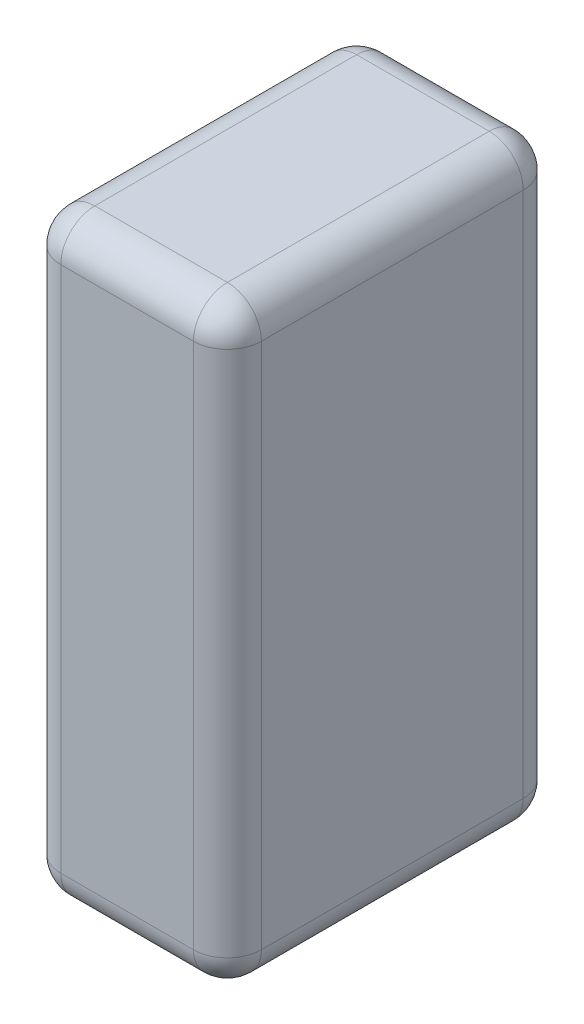
ISO-10303-21;
HEADER;
FILE_DESCRIPTION(('STEP AP214'),'2;1');
FILE_NAME('part.step','',(''),(''),'','','');
FILE_SCHEMA(('AUTOMOTIVE_DESIGN { 1 0 10303 214 1 1 1 1 }'));
ENDSEC;
DATA;
#1=APPLICATION_CONTEXT('core data for automotive mechanical design processes');
#2=APPLICATION_PROTOCOL_DEFINITION('international standard','automotive_design',2000,#1);
#3=PRODUCT_CONTEXT('',#1,'mechanical');
#4=PRODUCT('Part','Part','',(#3));
#5=PRODUCT_RELATED_PRODUCT_CATEGORY('part','',(#4));
#6=PRODUCT_DEFINITION_FORMATION('','',#4);
#7=PRODUCT_DEFINITION_CONTEXT('part definition',#1,'design');
#8=PRODUCT_DEFINITION('design','',#6,#7);
#9=PRODUCT_DEFINITION_SHAPE('','',#8);
#10=(LENGTH_UNIT() NAMED_UNIT(*) SI_UNIT(.MILLI.,.METRE.));
#11=(NAMED_UNIT(*) PLANE_ANGLE_UNIT() SI_UNIT($,.RADIAN.));
#12=(NAMED_UNIT(*) SI_UNIT($,.STERADIAN.) SOLID_ANGLE_UNIT());
#13=UNCERTAINTY_MEASURE_WITH_UNIT(LENGTH_MEASURE(1.E-05),#10,'distance_accuracy_value','');
#14=(GEOMETRIC_REPRESENTATION_CONTEXT(3) GLOBAL_UNCERTAINTY_ASSIGNED_CONTEXT((#13)) GLOBAL_UNIT_ASSIGNED_CONTEXT((#10,
#11,#12)) REPRESENTATION_CONTEXT('',''));
#15=CARTESIAN_POINT('',(0.,0.,0.));
#16=DIRECTION('',(0.,0.,1.));
#17=DIRECTION('',(1.,0.,0.));
#18=AXIS2_PLACEMENT_3D('',#15,#16,#17);
#19=CARTESIAN_POINT('',(2.95,17.5,-4.85));
#20=DIRECTION('',(-1.,0.,0.));
#21=DIRECTION('',(0.,0.,1.));
#22=AXIS2_PLACEMENT_3D('',#19,#20,#21);
#23=PLANE('',#22);
#24=DIRECTION('',(0.,0.,-1.));
#25=VECTOR('',#24,1.);
#26=CARTESIAN_POINT('',(2.95,1.,-4.85));
#27=LINE('',#26,#25);
#28=CARTESIAN_POINT('',(2.95,1.,3.85));
#29=VERTEX_POINT('',#28);
#30=CARTESIAN_POINT('',(2.95,1.,-3.85));
#31=VERTEX_POINT('',#30);
#32=EDGE_CURVE('E49',#29,#31,#27,.T.);
#33=ORIENTED_EDGE('',*,*,#32,.T.);
#34=DIRECTION('',(0.,-1.,0.));
#35=VECTOR('',#34,1.);
#36=CARTESIAN_POINT('',(2.95,17.5,-3.85));
#37=LINE('',#36,#35);
#38=CARTESIAN_POINT('',(2.95,16.5,-3.85));
#39=VERTEX_POINT('',#38);
#40=EDGE_CURVE('E11',#31,#39,#37,.F.);
#41=ORIENTED_EDGE('',*,*,#40,.T.);
#42=DIRECTION('',(0.,0.,-1.));
#43=VECTOR('',#42,1.);
#44=CARTESIAN_POINT('',(2.95,16.5,4.85));
#45=LINE('',#44,#43);
#46=CARTESIAN_POINT('',(2.95,16.5,3.85));
#47=VERTEX_POINT('',#46);
#48=EDGE_CURVE('E229',#39,#47,#45,.F.);
#49=ORIENTED_EDGE('',*,*,#48,.T.);
#50=DIRECTION('',(0.,-1.,0.));
#51=VECTOR('',#50,1.);
#52=CARTESIAN_POINT('',(2.95,17.5,3.85));
#53=LINE('',#52,#51);
#54=EDGE_CURVE('E226',#47,#29,#53,.T.);
#55=ORIENTED_EDGE('',*,*,#54,.T.);
#56=EDGE_LOOP('',(#33,#41,#49,#55));
#57=FACE_BOUND('',#56,.T.);
#58=ADVANCED_FACE('F39',(#57),#23,.F.);
#59=CARTESIAN_POINT('',(-2.95,17.5,-4.85));
#60=DIRECTION('',(0.,0.,1.));
#61=DIRECTION('',(1.,0.,0.));
#62=AXIS2_PLACEMENT_3D('',#59,#60,#61);
#63=PLANE('',#62);
#64=DIRECTION('',(-1.,0.,0.));
#65=VECTOR('',#64,1.);
#66=CARTESIAN_POINT('',(-2.95,1.,-4.85));
#67=LINE('',#66,#65);
#68=CARTESIAN_POINT('',(1.95,1.,-4.85));
#69=VERTEX_POINT('',#68);
#70=CARTESIAN_POINT('',(-1.95,1.,-4.85));
#71=VERTEX_POINT('',#70);
#72=EDGE_CURVE('E182',#69,#71,#67,.T.);
#73=ORIENTED_EDGE('',*,*,#72,.T.);
#74=DIRECTION('',(0.,-1.,0.));
#75=VECTOR('',#74,1.);
#76=CARTESIAN_POINT('',(-1.95,17.5,-4.85));
#77=LINE('',#76,#75);
#78=CARTESIAN_POINT('',(-1.95,16.5,-4.85));
#79=VERTEX_POINT('',#78);
#80=EDGE_CURVE('E139',#71,#79,#77,.F.);
#81=ORIENTED_EDGE('',*,*,#80,.T.);
#82=DIRECTION('',(-1.,0.,0.));
#83=VECTOR('',#82,1.);
#84=CARTESIAN_POINT('',(2.95,16.5,-4.85));
#85=LINE('',#84,#83);
#86=CARTESIAN_POINT('',(1.95,16.5,-4.85));
#87=VERTEX_POINT('',#86);
#88=EDGE_CURVE('E175',#79,#87,#85,.F.);
#89=ORIENTED_EDGE('',*,*,#88,.T.);
#90=DIRECTION('',(0.,-1.,0.));
#91=VECTOR('',#90,1.);
#92=CARTESIAN_POINT('',(1.95,17.5,-4.85));
#93=LINE('',#92,#91);
#94=EDGE_CURVE('E171',#87,#69,#93,.T.);
#95=ORIENTED_EDGE('',*,*,#94,.T.);
#96=EDGE_LOOP('',(#73,#81,#89,#95));
#97=FACE_BOUND('',#96,.T.);
#98=ADVANCED_FACE('F353',(#97),#63,.F.);
#99=CARTESIAN_POINT('',(-2.95,17.5,-4.85));
#100=DIRECTION('',(1.,0.,0.));
#101=DIRECTION('',(0.,0.,-1.));
#102=AXIS2_PLACEMENT_3D('',#99,#100,#101);
#103=PLANE('',#102);
#104=DIRECTION('',(0.,0.,1.));
#105=VECTOR('',#104,1.);
#106=CARTESIAN_POINT('',(-2.95,16.5,-4.85));
#107=LINE('',#106,#105);
#108=CARTESIAN_POINT('',(-2.95,16.5,3.85));
#109=VERTEX_POINT('',#108);
#110=CARTESIAN_POINT('',(-2.95,16.5,-3.85));
#111=VERTEX_POINT('',#110);
#112=EDGE_CURVE('E168',#109,#111,#107,.F.);
#113=ORIENTED_EDGE('',*,*,#112,.T.);
#114=DIRECTION('',(0.,-1.,0.));
#115=VECTOR('',#114,1.);
#116=CARTESIAN_POINT('',(-2.95,17.5,-3.85));
#117=LINE('',#116,#115);
#118=CARTESIAN_POINT('',(-2.95,1.,-3.85));
#119=VERTEX_POINT('',#118);
#120=EDGE_CURVE('E137',#111,#119,#117,.T.);
#121=ORIENTED_EDGE('',*,*,#120,.T.);
#122=DIRECTION('',(0.,0.,1.));
#123=VECTOR('',#122,1.);
#124=CARTESIAN_POINT('',(-2.95,1.,-4.85));
#125=LINE('',#124,#123);
#126=CARTESIAN_POINT('',(-2.95,1.,3.85));
#127=VERTEX_POINT('',#126);
#128=EDGE_CURVE('E157',#119,#127,#125,.T.);
#129=ORIENTED_EDGE('',*,*,#128,.T.);
#130=DIRECTION('',(0.,-1.,0.));
#131=VECTOR('',#130,1.);
#132=CARTESIAN_POINT('',(-2.95,17.5,3.85));
#133=LINE('',#132,#131);
#134=EDGE_CURVE('E164',#127,#109,#133,.F.);
#135=ORIENTED_EDGE('',*,*,#134,.T.);
#136=EDGE_LOOP('',(#113,#121,#129,#135));
#137=FACE_BOUND('',#136,.T.);
#138=ADVANCED_FACE('F166',(#137),#103,.F.);
#139=CARTESIAN_POINT('',(-2.95,17.5,4.85));
#140=DIRECTION('',(0.,0.,-1.));
#141=DIRECTION('',(-1.,0.,0.));
#142=AXIS2_PLACEMENT_3D('',#139,#140,#141);
#143=PLANE('',#142);
#144=DIRECTION('',(1.,0.,0.));
#145=VECTOR('',#144,1.);
#146=CARTESIAN_POINT('',(-2.95,16.5,4.85));
#147=LINE('',#146,#145);
#148=CARTESIAN_POINT('',(1.95,16.5,4.85));
#149=VERTEX_POINT('',#148);
#150=CARTESIAN_POINT('',(-1.95,16.5,4.85));
#151=VERTEX_POINT('',#150);
#152=EDGE_CURVE('E203',#149,#151,#147,.F.);
#153=ORIENTED_EDGE('',*,*,#152,.T.);
#154=DIRECTION('',(0.,-1.,0.));
#155=VECTOR('',#154,1.);
#156=CARTESIAN_POINT('',(-1.95,17.5,4.85));
#157=LINE('',#156,#155);
#158=CARTESIAN_POINT('',(-1.95,1.,4.85));
#159=VERTEX_POINT('',#158);
#160=EDGE_CURVE('E209',#151,#159,#157,.T.);
#161=ORIENTED_EDGE('',*,*,#160,.T.);
#162=DIRECTION('',(1.,0.,0.));
#163=VECTOR('',#162,1.);
#164=CARTESIAN_POINT('',(-2.95,1.,4.85));
#165=LINE('',#164,#163);
#166=CARTESIAN_POINT('',(1.95,1.,4.85));
#167=VERTEX_POINT('',#166);
#168=EDGE_CURVE('E206',#159,#167,#165,.T.);
#169=ORIENTED_EDGE('',*,*,#168,.T.);
#170=DIRECTION('',(0.,-1.,0.));
#171=VECTOR('',#170,1.);
#172=CARTESIAN_POINT('',(1.95,17.5,4.85));
#173=LINE('',#172,#171);
#174=EDGE_CURVE('E200',#167,#149,#173,.F.);
#175=ORIENTED_EDGE('',*,*,#174,.T.);
#176=EDGE_LOOP('',(#153,#161,#169,#175));
#177=FACE_BOUND('',#176,.T.);
#178=ADVANCED_FACE('F335',(#177),#143,.F.);
#179=CARTESIAN_POINT('',(0.,17.5,0.));
#180=DIRECTION('',(0.,1.,0.));
#181=DIRECTION('',(0.,0.,1.));
#182=AXIS2_PLACEMENT_3D('',#179,#180,#181);
#183=PLANE('',#182);
#184=DIRECTION('',(-1.,0.,0.));
#185=VECTOR('',#184,1.);
#186=CARTESIAN_POINT('',(-2.95,17.5,-3.85));
#187=LINE('',#186,#185);
#188=CARTESIAN_POINT('',(1.95,17.5,-3.85));
#189=VERTEX_POINT('',#188);
#190=CARTESIAN_POINT('',(-1.95,17.5,-3.85));
#191=VERTEX_POINT('',#190);
#192=EDGE_CURVE('E193',#189,#191,#187,.T.);
#193=ORIENTED_EDGE('',*,*,#192,.T.);
#194=DIRECTION('',(0.,0.,1.));
#195=VECTOR('',#194,1.);
#196=CARTESIAN_POINT('',(-1.95,17.5,4.85));
#197=LINE('',#196,#195);
#198=CARTESIAN_POINT('',(-1.95,17.5,3.85));
#199=VERTEX_POINT('',#198);
#200=EDGE_CURVE('E196',#191,#199,#197,.T.);
#201=ORIENTED_EDGE('',*,*,#200,.T.);
#202=DIRECTION('',(1.,0.,0.));
#203=VECTOR('',#202,1.);
#204=CARTESIAN_POINT('',(2.95,17.5,3.85));
#205=LINE('',#204,#203);
#206=CARTESIAN_POINT('',(1.95,17.5,3.85));
#207=VERTEX_POINT('',#206);
#208=EDGE_CURVE('E187',#199,#207,#205,.T.);
#209=ORIENTED_EDGE('',*,*,#208,.T.);
#210=DIRECTION('',(0.,0.,-1.));
#211=VECTOR('',#210,1.);
#212=CARTESIAN_POINT('',(1.95,17.5,-4.85));
#213=LINE('',#212,#211);
#214=EDGE_CURVE('E190',#207,#189,#213,.T.);
#215=ORIENTED_EDGE('',*,*,#214,.T.);
#216=EDGE_LOOP('',(#193,#201,#209,#215));
#217=FACE_BOUND('',#216,.T.);
#218=ADVANCED_FACE('F326',(#217),#183,.T.);
#219=CARTESIAN_POINT('',(0.,0.,0.));
#220=DIRECTION('',(0.,1.,0.));
#221=DIRECTION('',(0.,0.,1.));
#222=AXIS2_PLACEMENT_3D('',#219,#220,#221);
#223=PLANE('',#222);
#224=DIRECTION('',(1.,0.,0.));
#225=VECTOR('',#224,1.);
#226=CARTESIAN_POINT('',(0.,0.,3.85));
#227=LINE('',#226,#225);
#228=CARTESIAN_POINT('',(1.95,0.,3.85));
#229=VERTEX_POINT('',#228);
#230=CARTESIAN_POINT('',(-1.95,0.,3.85));
#231=VERTEX_POINT('',#230);
#232=EDGE_CURVE('E213',#229,#231,#227,.F.);
#233=ORIENTED_EDGE('',*,*,#232,.T.);
#234=DIRECTION('',(0.,0.,1.));
#235=VECTOR('',#234,1.);
#236=CARTESIAN_POINT('',(-1.95,0.,0.));
#237=LINE('',#236,#235);
#238=CARTESIAN_POINT('',(-1.95,0.,-3.85));
#239=VERTEX_POINT('',#238);
#240=EDGE_CURVE('E222',#231,#239,#237,.F.);
#241=ORIENTED_EDGE('',*,*,#240,.T.);
#242=DIRECTION('',(-1.,0.,0.));
#243=VECTOR('',#242,1.);
#244=CARTESIAN_POINT('',(0.,0.,-3.85));
#245=LINE('',#244,#243);
#246=CARTESIAN_POINT('',(1.95,0.,-3.85));
#247=VERTEX_POINT('',#246);
#248=EDGE_CURVE('E219',#239,#247,#245,.F.);
#249=ORIENTED_EDGE('',*,*,#248,.T.);
#250=DIRECTION('',(0.,0.,-1.));
#251=VECTOR('',#250,1.);
#252=CARTESIAN_POINT('',(1.95,0.,0.));
#253=LINE('',#252,#251);
#254=EDGE_CURVE('E216',#247,#229,#253,.F.);
#255=ORIENTED_EDGE('',*,*,#254,.T.);
#256=EDGE_LOOP('',(#233,#241,#249,#255));
#257=FACE_BOUND('',#256,.T.);
#258=ADVANCED_FACE('F417',(#257),#223,.F.);
#259=CARTESIAN_POINT('',(1.95,17.5,3.85));
#260=DIRECTION('',(0.,-1.,0.));
#261=DIRECTION('',(0.,0.,-1.));
#262=AXIS2_PLACEMENT_3D('',#259,#260,#261);
#263=CYLINDRICAL_SURFACE('',#262,1.);
#264=CARTESIAN_POINT('',(1.95,16.5,3.85));
#265=DIRECTION('',(0.,1.,0.));
#266=DIRECTION('',(0.,0.,1.));
#267=AXIS2_PLACEMENT_3D('',#264,#265,#266);
#268=CIRCLE('',#267,1.);
#269=EDGE_CURVE('E43',#149,#47,#268,.T.);
#270=ORIENTED_EDGE('',*,*,#269,.F.);
#271=ORIENTED_EDGE('',*,*,#174,.F.);
#272=CARTESIAN_POINT('',(1.95,1.,3.85));
#273=DIRECTION('',(0.,-1.,0.));
#274=DIRECTION('',(0.,0.,-1.));
#275=AXIS2_PLACEMENT_3D('',#272,#273,#274);
#276=CIRCLE('',#275,1.);
#277=EDGE_CURVE('E301',#29,#167,#276,.T.);
#278=ORIENTED_EDGE('',*,*,#277,.F.);
#279=ORIENTED_EDGE('',*,*,#54,.F.);
#280=EDGE_LOOP('',(#270,#271,#278,#279));
#281=FACE_BOUND('',#280,.T.);
#282=ADVANCED_FACE('F41',(#281),#263,.T.);
#283=CARTESIAN_POINT('',(1.95,16.5,3.85));
#284=DIRECTION('',(0.,0.,1.));
#285=DIRECTION('',(1.,0.,0.));
#286=AXIS2_PLACEMENT_3D('',#283,#284,#285);
#287=SPHERICAL_SURFACE('',#286,1.);
#288=CARTESIAN_POINT('',(1.95,16.5,3.85));
#289=DIRECTION('',(1.,0.,0.));
#290=DIRECTION('',(0.,0.,-1.));
#291=AXIS2_PLACEMENT_3D('',#288,#289,#290);
#292=CIRCLE('',#291,1.);
#293=EDGE_CURVE('E294',#149,#207,#292,.F.);
#294=ORIENTED_EDGE('',*,*,#293,.F.);
#295=ORIENTED_EDGE('',*,*,#269,.T.);
#296=CARTESIAN_POINT('',(1.95,16.5,3.85));
#297=DIRECTION('',(0.,0.,1.));
#298=DIRECTION('',(0.,-1.,0.));
#299=AXIS2_PLACEMENT_3D('',#296,#297,#298);
#300=CIRCLE('',#299,1.);
#301=EDGE_CURVE('E298',#207,#47,#300,.F.);
#302=ORIENTED_EDGE('',*,*,#301,.F.);
#303=EDGE_LOOP('',(#294,#295,#302));
#304=FACE_BOUND('',#303,.T.);
#305=ADVANCED_FACE('F314',(#304),#287,.T.);
#306=CARTESIAN_POINT('',(1.95,1.,3.85));
#307=DIRECTION('',(0.,0.,1.));
#308=DIRECTION('',(1.,0.,0.));
#309=AXIS2_PLACEMENT_3D('',#306,#307,#308);
#310=SPHERICAL_SURFACE('',#309,1.);
#311=CARTESIAN_POINT('',(1.95,1.,3.85));
#312=DIRECTION('',(0.,0.,1.));
#313=DIRECTION('',(1.,0.,0.));
#314=AXIS2_PLACEMENT_3D('',#311,#312,#313);
#315=CIRCLE('',#314,1.);
#316=EDGE_CURVE('E286',#29,#229,#315,.F.);
#317=ORIENTED_EDGE('',*,*,#316,.F.);
#318=ORIENTED_EDGE('',*,*,#277,.T.);
#319=CARTESIAN_POINT('',(1.95,1.,3.85));
#320=DIRECTION('',(1.,0.,0.));
#321=DIRECTION('',(0.,0.,-1.));
#322=AXIS2_PLACEMENT_3D('',#319,#320,#321);
#323=CIRCLE('',#322,1.);
#324=EDGE_CURVE('E290',#229,#167,#323,.F.);
#325=ORIENTED_EDGE('',*,*,#324,.F.);
#326=EDGE_LOOP('',(#317,#318,#325));
#327=FACE_BOUND('',#326,.T.);
#328=ADVANCED_FACE('F348',(#327),#310,.T.);
#329=CARTESIAN_POINT('',(1.95,16.5,0.));
#330=DIRECTION('',(0.,0.,1.));
#331=DIRECTION('',(1.,0.,0.));
#332=AXIS2_PLACEMENT_3D('',#329,#330,#331);
#333=CYLINDRICAL_SURFACE('',#332,1.);
#334=ORIENTED_EDGE('',*,*,#301,.T.);
#335=ORIENTED_EDGE('',*,*,#48,.F.);
#336=CARTESIAN_POINT('',(1.95,16.5,-3.85));
#337=DIRECTION('',(0.,0.,-1.));
#338=DIRECTION('',(-1.,0.,0.));
#339=AXIS2_PLACEMENT_3D('',#336,#337,#338);
#340=CIRCLE('',#339,1.);
#341=EDGE_CURVE('E278',#189,#39,#340,.T.);
#342=ORIENTED_EDGE('',*,*,#341,.F.);
#343=ORIENTED_EDGE('',*,*,#214,.F.);
#344=EDGE_LOOP('',(#334,#335,#342,#343));
#345=FACE_BOUND('',#344,.T.);
#346=ADVANCED_FACE('F321',(#345),#333,.T.);
#347=CARTESIAN_POINT('',(0.,16.5,3.85));
#348=DIRECTION('',(-1.,0.,0.));
#349=DIRECTION('',(0.,0.,1.));
#350=AXIS2_PLACEMENT_3D('',#347,#348,#349);
#351=CYLINDRICAL_SURFACE('',#350,1.);
#352=ORIENTED_EDGE('',*,*,#293,.T.);
#353=ORIENTED_EDGE('',*,*,#208,.F.);
#354=CARTESIAN_POINT('',(-1.95,16.5,3.85));
#355=DIRECTION('',(-1.,0.,0.));
#356=DIRECTION('',(0.,0.,1.));
#357=AXIS2_PLACEMENT_3D('',#354,#355,#356);
#358=CIRCLE('',#357,1.);
#359=EDGE_CURVE('E274',#151,#199,#358,.T.);
#360=ORIENTED_EDGE('',*,*,#359,.F.);
#361=ORIENTED_EDGE('',*,*,#152,.F.);
#362=EDGE_LOOP('',(#352,#353,#360,#361));
#363=FACE_BOUND('',#362,.T.);
#364=ADVANCED_FACE('F332',(#363),#351,.T.);
#365=CARTESIAN_POINT('',(-1.95,17.5,3.85));
#366=DIRECTION('',(0.,-1.,0.));
#367=DIRECTION('',(0.,0.,-1.));
#368=AXIS2_PLACEMENT_3D('',#365,#366,#367);
#369=CYLINDRICAL_SURFACE('',#368,1.);
#370=CARTESIAN_POINT('',(-1.95,1.,3.85));
#371=DIRECTION('',(0.,-1.,0.));
#372=DIRECTION('',(0.,0.,-1.));
#373=AXIS2_PLACEMENT_3D('',#370,#371,#372);
#374=CIRCLE('',#373,1.);
#375=EDGE_CURVE('E266',#159,#127,#374,.T.);
#376=ORIENTED_EDGE('',*,*,#375,.F.);
#377=ORIENTED_EDGE('',*,*,#160,.F.);
#378=CARTESIAN_POINT('',(-1.95,16.5,3.85));
#379=DIRECTION('',(0.,1.,0.));
#380=DIRECTION('',(0.,0.,1.));
#381=AXIS2_PLACEMENT_3D('',#378,#379,#380);
#382=CIRCLE('',#381,1.);
#383=EDGE_CURVE('E270',#109,#151,#382,.T.);
#384=ORIENTED_EDGE('',*,*,#383,.F.);
#385=ORIENTED_EDGE('',*,*,#134,.F.);
#386=EDGE_LOOP('',(#376,#377,#384,#385));
#387=FACE_BOUND('',#386,.T.);
#388=ADVANCED_FACE('F339',(#387),#369,.T.);
#389=CARTESIAN_POINT('',(-2.95,1.,3.85));
#390=DIRECTION('',(1.,0.,0.));
#391=DIRECTION('',(0.,0.,-1.));
#392=AXIS2_PLACEMENT_3D('',#389,#390,#391);
#393=CYLINDRICAL_SURFACE('',#392,1.);
#394=ORIENTED_EDGE('',*,*,#324,.T.);
#395=ORIENTED_EDGE('',*,*,#168,.F.);
#396=CARTESIAN_POINT('',(-1.95,1.,3.85));
#397=DIRECTION('',(-1.,0.,0.));
#398=DIRECTION('',(0.,0.,1.));
#399=AXIS2_PLACEMENT_3D('',#396,#397,#398);
#400=CIRCLE('',#399,1.);
#401=EDGE_CURVE('E263',#231,#159,#400,.T.);
#402=ORIENTED_EDGE('',*,*,#401,.F.);
#403=ORIENTED_EDGE('',*,*,#232,.F.);
#404=EDGE_LOOP('',(#394,#395,#402,#403));
#405=FACE_BOUND('',#404,.T.);
#406=ADVANCED_FACE('F345',(#405),#393,.T.);
#407=CARTESIAN_POINT('',(1.95,1.,-4.85));
#408=DIRECTION('',(0.,0.,-1.));
#409=DIRECTION('',(-1.,0.,0.));
#410=AXIS2_PLACEMENT_3D('',#407,#408,#409);
#411=CYLINDRICAL_SURFACE('',#410,1.);
#412=ORIENTED_EDGE('',*,*,#316,.T.);
#413=ORIENTED_EDGE('',*,*,#254,.F.);
#414=CARTESIAN_POINT('',(1.95,1.,-3.85));
#415=DIRECTION('',(0.,0.,-1.));
#416=DIRECTION('',(-1.,0.,0.));
#417=AXIS2_PLACEMENT_3D('',#414,#415,#416);
#418=CIRCLE('',#417,1.);
#419=EDGE_CURVE('E260',#31,#247,#418,.T.);
#420=ORIENTED_EDGE('',*,*,#419,.F.);
#421=ORIENTED_EDGE('',*,*,#32,.F.);
#422=EDGE_LOOP('',(#412,#413,#420,#421));
#423=FACE_BOUND('',#422,.T.);
#424=ADVANCED_FACE('F351',(#423),#411,.T.);
#425=CARTESIAN_POINT('',(1.95,17.5,-3.85));
#426=DIRECTION('',(0.,-1.,0.));
#427=DIRECTION('',(0.,0.,-1.));
#428=AXIS2_PLACEMENT_3D('',#425,#426,#427);
#429=CYLINDRICAL_SURFACE('',#428,1.);
#430=CARTESIAN_POINT('',(1.95,16.5,-3.85));
#431=DIRECTION('',(0.,1.,0.));
#432=DIRECTION('',(0.,0.,1.));
#433=AXIS2_PLACEMENT_3D('',#430,#431,#432);
#434=CIRCLE('',#433,1.);
#435=EDGE_CURVE('E282',#39,#87,#434,.T.);
#436=ORIENTED_EDGE('',*,*,#435,.F.);
#437=ORIENTED_EDGE('',*,*,#40,.F.);
#438=CARTESIAN_POINT('',(1.95,1.,-3.85));
#439=DIRECTION('',(0.,-1.,0.));
#440=DIRECTION('',(0.,0.,-1.));
#441=AXIS2_PLACEMENT_3D('',#438,#439,#440);
#442=CIRCLE('',#441,1.);
#443=EDGE_CURVE('E57',#69,#31,#442,.T.);
#444=ORIENTED_EDGE('',*,*,#443,.F.);
#445=ORIENTED_EDGE('',*,*,#94,.F.);
#446=EDGE_LOOP('',(#436,#437,#444,#445));
#447=FACE_BOUND('',#446,.T.);
#448=ADVANCED_FACE('F397',(#447),#429,.T.);
#449=CARTESIAN_POINT('',(1.95,16.5,-3.85));
#450=DIRECTION('',(0.,0.,1.));
#451=DIRECTION('',(1.,0.,0.));
#452=AXIS2_PLACEMENT_3D('',#449,#450,#451);
#453=SPHERICAL_SURFACE('',#452,1.);
#454=ORIENTED_EDGE('',*,*,#341,.T.);
#455=ORIENTED_EDGE('',*,*,#435,.T.);
#456=CARTESIAN_POINT('',(1.95,16.5,-3.85));
#457=DIRECTION('',(1.,0.,0.));
#458=DIRECTION('',(0.,0.,-1.));
#459=AXIS2_PLACEMENT_3D('',#456,#457,#458);
#460=CIRCLE('',#459,1.);
#461=EDGE_CURVE('E254',#189,#87,#460,.F.);
#462=ORIENTED_EDGE('',*,*,#461,.F.);
#463=EDGE_LOOP('',(#454,#455,#462));
#464=FACE_BOUND('',#463,.T.);
#465=ADVANCED_FACE('F393',(#464),#453,.T.);
#466=CARTESIAN_POINT('',(-1.95,16.5,3.85));
#467=DIRECTION('',(0.,0.,1.));
#468=DIRECTION('',(1.,0.,0.));
#469=AXIS2_PLACEMENT_3D('',#466,#467,#468);
#470=SPHERICAL_SURFACE('',#469,1.);
#471=ORIENTED_EDGE('',*,*,#383,.T.);
#472=ORIENTED_EDGE('',*,*,#359,.T.);
#473=CARTESIAN_POINT('',(-1.95,16.5,3.85));
#474=DIRECTION('',(0.,0.,1.));
#475=DIRECTION('',(1.,0.,0.));
#476=AXIS2_PLACEMENT_3D('',#473,#474,#475);
#477=CIRCLE('',#476,1.);
#478=EDGE_CURVE('E251',#109,#199,#477,.F.);
#479=ORIENTED_EDGE('',*,*,#478,.F.);
#480=EDGE_LOOP('',(#471,#472,#479));
#481=FACE_BOUND('',#480,.T.);
#482=ADVANCED_FACE('F390',(#481),#470,.T.);
#483=CARTESIAN_POINT('',(-1.95,1.,3.85));
#484=DIRECTION('',(0.,0.,1.));
#485=DIRECTION('',(1.,0.,0.));
#486=AXIS2_PLACEMENT_3D('',#483,#484,#485);
#487=SPHERICAL_SURFACE('',#486,1.);
#488=ORIENTED_EDGE('',*,*,#401,.T.);
#489=ORIENTED_EDGE('',*,*,#375,.T.);
#490=CARTESIAN_POINT('',(-1.95,1.,3.85));
#491=DIRECTION('',(0.,0.,1.));
#492=DIRECTION('',(1.,0.,0.));
#493=AXIS2_PLACEMENT_3D('',#490,#491,#492);
#494=CIRCLE('',#493,1.);
#495=EDGE_CURVE('E160',#231,#127,#494,.F.);
#496=ORIENTED_EDGE('',*,*,#495,.F.);
#497=EDGE_LOOP('',(#488,#489,#496));
#498=FACE_BOUND('',#497,.T.);
#499=ADVANCED_FACE('F387',(#498),#487,.T.);
#500=CARTESIAN_POINT('',(1.95,1.,-3.85));
#501=DIRECTION('',(0.,0.,1.));
#502=DIRECTION('',(1.,0.,0.));
#503=AXIS2_PLACEMENT_3D('',#500,#501,#502);
#504=SPHERICAL_SURFACE('',#503,1.);
#505=ORIENTED_EDGE('',*,*,#443,.T.);
#506=ORIENTED_EDGE('',*,*,#419,.T.);
#507=CARTESIAN_POINT('',(1.95,1.,-3.85));
#508=DIRECTION('',(1.,0.,0.));
#509=DIRECTION('',(0.,0.,-1.));
#510=AXIS2_PLACEMENT_3D('',#507,#508,#509);
#511=CIRCLE('',#510,1.);
#512=EDGE_CURVE('E245',#69,#247,#511,.F.);
#513=ORIENTED_EDGE('',*,*,#512,.F.);
#514=EDGE_LOOP('',(#505,#506,#513));
#515=FACE_BOUND('',#514,.T.);
#516=ADVANCED_FACE('F383',(#515),#504,.T.);
#517=CARTESIAN_POINT('',(0.,16.5,-3.85));
#518=DIRECTION('',(1.,0.,0.));
#519=DIRECTION('',(0.,0.,-1.));
#520=AXIS2_PLACEMENT_3D('',#517,#518,#519);
#521=CYLINDRICAL_SURFACE('',#520,1.);
#522=ORIENTED_EDGE('',*,*,#461,.T.);
#523=ORIENTED_EDGE('',*,*,#88,.F.);
#524=CARTESIAN_POINT('',(-1.95,16.5,-3.85));
#525=DIRECTION('',(-1.,0.,0.));
#526=DIRECTION('',(0.,0.,1.));
#527=AXIS2_PLACEMENT_3D('',#524,#525,#526);
#528=CIRCLE('',#527,1.);
#529=EDGE_CURVE('E241',#191,#79,#528,.T.);
#530=ORIENTED_EDGE('',*,*,#529,.F.);
#531=ORIENTED_EDGE('',*,*,#192,.F.);
#532=EDGE_LOOP('',(#522,#523,#530,#531));
#533=FACE_BOUND('',#532,.T.);
#534=ADVANCED_FACE('F379',(#533),#521,.T.);
#535=CARTESIAN_POINT('',(-1.95,16.5,0.));
#536=DIRECTION('',(0.,0.,-1.));
#537=DIRECTION('',(-1.,0.,0.));
#538=AXIS2_PLACEMENT_3D('',#535,#536,#537);
#539=CYLINDRICAL_SURFACE('',#538,1.);
#540=ORIENTED_EDGE('',*,*,#478,.T.);
#541=ORIENTED_EDGE('',*,*,#200,.F.);
#542=CARTESIAN_POINT('',(-1.95,16.5,-3.85));
#543=DIRECTION('',(0.,0.,-1.));
#544=DIRECTION('',(-1.,0.,0.));
#545=AXIS2_PLACEMENT_3D('',#542,#543,#544);
#546=CIRCLE('',#545,1.);
#547=EDGE_CURVE('E154',#111,#191,#546,.T.);
#548=ORIENTED_EDGE('',*,*,#547,.F.);
#549=ORIENTED_EDGE('',*,*,#112,.F.);
#550=EDGE_LOOP('',(#540,#541,#548,#549));
#551=FACE_BOUND('',#550,.T.);
#552=ADVANCED_FACE('F376',(#551),#539,.T.);
#553=CARTESIAN_POINT('',(-1.95,1.,-4.85));
#554=DIRECTION('',(0.,0.,1.));
#555=DIRECTION('',(1.,0.,0.));
#556=AXIS2_PLACEMENT_3D('',#553,#554,#555);
#557=CYLINDRICAL_SURFACE('',#556,1.);
#558=ORIENTED_EDGE('',*,*,#495,.T.);
#559=ORIENTED_EDGE('',*,*,#128,.F.);
#560=CARTESIAN_POINT('',(-1.95,1.,-3.85));
#561=DIRECTION('',(0.,0.,-1.));
#562=DIRECTION('',(-1.,0.,0.));
#563=AXIS2_PLACEMENT_3D('',#560,#561,#562);
#564=CIRCLE('',#563,1.);
#565=EDGE_CURVE('E145',#239,#119,#564,.T.);
#566=ORIENTED_EDGE('',*,*,#565,.F.);
#567=ORIENTED_EDGE('',*,*,#240,.F.);
#568=EDGE_LOOP('',(#558,#559,#566,#567));
#569=FACE_BOUND('',#568,.T.);
#570=ADVANCED_FACE('F158',(#569),#557,.T.);
#571=CARTESIAN_POINT('',(-2.95,1.,-3.85));
#572=DIRECTION('',(-1.,0.,0.));
#573=DIRECTION('',(0.,0.,1.));
#574=AXIS2_PLACEMENT_3D('',#571,#572,#573);
#575=CYLINDRICAL_SURFACE('',#574,1.);
#576=ORIENTED_EDGE('',*,*,#512,.T.);
#577=ORIENTED_EDGE('',*,*,#248,.F.);
#578=CARTESIAN_POINT('',(-1.95,1.,-3.85));
#579=DIRECTION('',(-1.,0.,0.));
#580=DIRECTION('',(0.,0.,1.));
#581=AXIS2_PLACEMENT_3D('',#578,#579,#580);
#582=CIRCLE('',#581,1.);
#583=EDGE_CURVE('E149',#71,#239,#582,.T.);
#584=ORIENTED_EDGE('',*,*,#583,.F.);
#585=ORIENTED_EDGE('',*,*,#72,.F.);
#586=EDGE_LOOP('',(#576,#577,#584,#585));
#587=FACE_BOUND('',#586,.T.);
#588=ADVANCED_FACE('F369',(#587),#575,.T.);
#589=CARTESIAN_POINT('',(-1.95,16.5,-3.85));
#590=DIRECTION('',(0.,0.,1.));
#591=DIRECTION('',(1.,0.,0.));
#592=AXIS2_PLACEMENT_3D('',#589,#590,#591);
#593=SPHERICAL_SURFACE('',#592,1.);
#594=ORIENTED_EDGE('',*,*,#547,.T.);
#595=ORIENTED_EDGE('',*,*,#529,.T.);
#596=CARTESIAN_POINT('',(-1.95,16.5,-3.85));
#597=DIRECTION('',(0.,1.,0.));
#598=DIRECTION('',(0.,0.,1.));
#599=AXIS2_PLACEMENT_3D('',#596,#597,#598);
#600=CIRCLE('',#599,1.);
#601=EDGE_CURVE('E142',#111,#79,#600,.F.);
#602=ORIENTED_EDGE('',*,*,#601,.F.);
#603=EDGE_LOOP('',(#594,#595,#602));
#604=FACE_BOUND('',#603,.T.);
#605=ADVANCED_FACE('F366',(#604),#593,.T.);
#606=CARTESIAN_POINT('',(-1.95,1.,-3.85));
#607=DIRECTION('',(0.,0.,1.));
#608=DIRECTION('',(1.,0.,0.));
#609=AXIS2_PLACEMENT_3D('',#606,#607,#608);
#610=SPHERICAL_SURFACE('',#609,1.);
#611=ORIENTED_EDGE('',*,*,#583,.T.);
#612=ORIENTED_EDGE('',*,*,#565,.T.);
#613=CARTESIAN_POINT('',(-1.95,1.,-3.85));
#614=DIRECTION('',(0.,-1.,0.));
#615=DIRECTION('',(0.,0.,-1.));
#616=AXIS2_PLACEMENT_3D('',#613,#614,#615);
#617=CIRCLE('',#616,1.);
#618=EDGE_CURVE('E133',#71,#119,#617,.F.);
#619=ORIENTED_EDGE('',*,*,#618,.F.);
#620=EDGE_LOOP('',(#611,#612,#619));
#621=FACE_BOUND('',#620,.T.);
#622=ADVANCED_FACE('F147',(#621),#610,.T.);
#623=CARTESIAN_POINT('',(-1.95,17.5,-3.85));
#624=DIRECTION('',(0.,-1.,0.));
#625=DIRECTION('',(0.,0.,-1.));
#626=AXIS2_PLACEMENT_3D('',#623,#624,#625);
#627=CYLINDRICAL_SURFACE('',#626,1.);
#628=ORIENTED_EDGE('',*,*,#601,.T.);
#629=ORIENTED_EDGE('',*,*,#80,.F.);
#630=ORIENTED_EDGE('',*,*,#618,.T.);
#631=ORIENTED_EDGE('',*,*,#120,.F.);
#632=EDGE_LOOP('',(#628,#629,#630,#631));
#633=FACE_BOUND('',#632,.T.);
#634=ADVANCED_FACE('F135',(#633),#627,.T.);
#635=CLOSED_SHELL('',(#58,#98,#138,#178,#218,#258,#282,#305,#328,#346,#364,#388,#406,#424,#448,
#465,#482,#499,#516,#534,#552,#570,#588,#605,#622,#634));
#636=MANIFOLD_SOLID_BREP('B2',#635);
#637=ADVANCED_BREP_SHAPE_REPRESENTATION('',(#18,#636),#14);
#638=SHAPE_DEFINITION_REPRESENTATION(#9,#637);
ENDSEC;
END-ISO-10303-21;
